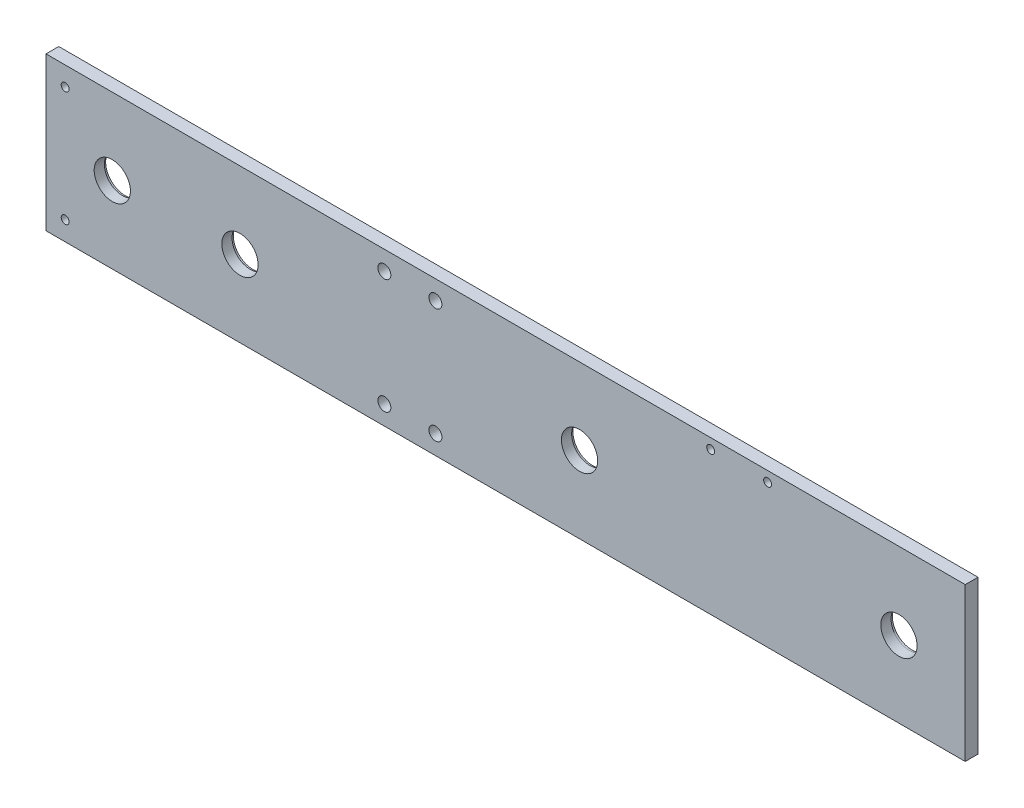
ISO-10303-21;
HEADER;
FILE_DESCRIPTION(('STEP AP214'),'2;1');
FILE_NAME('part.step','',(''),(''),'','','');
FILE_SCHEMA(('AUTOMOTIVE_DESIGN { 1 0 10303 214 1 1 1 1 }'));
ENDSEC;
DATA;
#1=APPLICATION_CONTEXT('core data for automotive mechanical design processes');
#2=APPLICATION_PROTOCOL_DEFINITION('international standard','automotive_design',2000,#1);
#3=PRODUCT_CONTEXT('',#1,'mechanical');
#4=PRODUCT('Part','Part','',(#3));
#5=PRODUCT_RELATED_PRODUCT_CATEGORY('part','',(#4));
#6=PRODUCT_DEFINITION_FORMATION('','',#4);
#7=PRODUCT_DEFINITION_CONTEXT('part definition',#1,'design');
#8=PRODUCT_DEFINITION('design','',#6,#7);
#9=PRODUCT_DEFINITION_SHAPE('','',#8);
#10=(LENGTH_UNIT() NAMED_UNIT(*) SI_UNIT(.MILLI.,.METRE.));
#11=(NAMED_UNIT(*) PLANE_ANGLE_UNIT() SI_UNIT($,.RADIAN.));
#12=(NAMED_UNIT(*) SI_UNIT($,.STERADIAN.) SOLID_ANGLE_UNIT());
#13=UNCERTAINTY_MEASURE_WITH_UNIT(LENGTH_MEASURE(1.E-05),#10,'distance_accuracy_value','');
#14=(GEOMETRIC_REPRESENTATION_CONTEXT(3) GLOBAL_UNCERTAINTY_ASSIGNED_CONTEXT((#13)) GLOBAL_UNIT_ASSIGNED_CONTEXT((#10,
#11,#12)) REPRESENTATION_CONTEXT('',''));
#15=CARTESIAN_POINT('',(0.,0.,0.));
#16=DIRECTION('',(0.,0.,1.));
#17=DIRECTION('',(1.,0.,0.));
#18=AXIS2_PLACEMENT_3D('',#15,#16,#17);
#19=CARTESIAN_POINT('',(0.,0.,-4.));
#20=DIRECTION('',(0.,0.,1.));
#21=DIRECTION('',(1.,0.,0.));
#22=AXIS2_PLACEMENT_3D('',#19,#20,#21);
#23=PLANE('',#22);
#24=CARTESIAN_POINT('',(183.,0.,-4.));
#25=DIRECTION('',(0.,0.,1.));
#26=DIRECTION('',(1.,0.,0.));
#27=AXIS2_PLACEMENT_3D('',#24,#25,#26);
#28=CIRCLE('',#27,7.10000000000001);
#29=CARTESIAN_POINT('',(190.1,0.,-4.));
#30=VERTEX_POINT('',#29);
#31=EDGE_CURVE('E135',#30,#30,#28,.T.);
#32=ORIENTED_EDGE('',*,*,#31,.T.);
#33=EDGE_LOOP('',(#32));
#34=FACE_BOUND('',#33,.T.);
#35=CARTESIAN_POINT('',(183.,0.,-4.));
#36=DIRECTION('',(0.,0.,-1.));
#37=DIRECTION('',(-1.,0.,0.));
#38=AXIS2_PLACEMENT_3D('',#35,#36,#37);
#39=CIRCLE('',#38,7.60000000000001);
#40=CARTESIAN_POINT('',(175.4,0.,-4.));
#41=VERTEX_POINT('',#40);
#42=EDGE_CURVE('E115',#41,#41,#39,.T.);
#43=ORIENTED_EDGE('',*,*,#42,.T.);
#44=EDGE_LOOP('',(#43));
#45=FACE_BOUND('',#44,.T.);
#46=ADVANCED_FACE('F34',(#34,#45),#23,.F.);
#47=CARTESIAN_POINT('',(49.9999999999999,0.,-4.));
#48=DIRECTION('',(0.,0.,1.));
#49=DIRECTION('',(1.,0.,0.));
#50=AXIS2_PLACEMENT_3D('',#47,#48,#49);
#51=CIRCLE('',#50,7.09999999999999);
#52=CARTESIAN_POINT('',(57.0999999999999,0.,-4.));
#53=VERTEX_POINT('',#52);
#54=EDGE_CURVE('E141',#53,#53,#51,.T.);
#55=ORIENTED_EDGE('',*,*,#54,.T.);
#56=EDGE_LOOP('',(#55));
#57=FACE_BOUND('',#56,.T.);
#58=CARTESIAN_POINT('',(49.9999999999999,0.,-4.));
#59=DIRECTION('',(0.,0.,-1.));
#60=DIRECTION('',(-1.,0.,0.));
#61=AXIS2_PLACEMENT_3D('',#58,#59,#60);
#62=CIRCLE('',#61,7.6);
#63=CARTESIAN_POINT('',(42.3999999999999,0.,-4.));
#64=VERTEX_POINT('',#63);
#65=EDGE_CURVE('E118',#64,#64,#62,.T.);
#66=ORIENTED_EDGE('',*,*,#65,.T.);
#67=EDGE_LOOP('',(#66));
#68=FACE_BOUND('',#67,.T.);
#69=ADVANCED_FACE('F185',(#57,#68),#23,.F.);
#70=CARTESIAN_POINT('',(0.,-1.01224326104513E-13,-4.));
#71=DIRECTION('',(0.,0.,1.));
#72=DIRECTION('',(1.,0.,0.));
#73=AXIS2_PLACEMENT_3D('',#70,#71,#72);
#74=CIRCLE('',#73,7.1);
#75=CARTESIAN_POINT('',(7.10000000000002,-1.01224326104513E-13,-4.));
#76=VERTEX_POINT('',#75);
#77=EDGE_CURVE('E150',#76,#76,#74,.T.);
#78=ORIENTED_EDGE('',*,*,#77,.T.);
#79=EDGE_LOOP('',(#78));
#80=FACE_BOUND('',#79,.T.);
#81=CARTESIAN_POINT('',(0.,0.,-4.));
#82=DIRECTION('',(0.,0.,-1.));
#83=DIRECTION('',(-1.,0.,0.));
#84=AXIS2_PLACEMENT_3D('',#81,#82,#83);
#85=CIRCLE('',#84,7.6);
#86=CARTESIAN_POINT('',(-7.59999999999998,0.,-4.));
#87=VERTEX_POINT('',#86);
#88=EDGE_CURVE('E122',#87,#87,#85,.T.);
#89=ORIENTED_EDGE('',*,*,#88,.T.);
#90=EDGE_LOOP('',(#89));
#91=FACE_BOUND('',#90,.T.);
#92=ADVANCED_FACE('F191',(#80,#91),#23,.F.);
#93=CARTESIAN_POINT('',(308.082550187469,-0.200000000000128,-4.));
#94=DIRECTION('',(0.,0.,1.));
#95=DIRECTION('',(1.,0.,0.));
#96=AXIS2_PLACEMENT_3D('',#93,#94,#95);
#97=CIRCLE('',#96,7.09999999999998);
#98=CARTESIAN_POINT('',(315.182550187469,-0.200000000000128,-4.));
#99=VERTEX_POINT('',#98);
#100=EDGE_CURVE('E159',#99,#99,#97,.T.);
#101=ORIENTED_EDGE('',*,*,#100,.T.);
#102=EDGE_LOOP('',(#101));
#103=FACE_BOUND('',#102,.T.);
#104=CARTESIAN_POINT('',(308.082550187468,0.,-4.));
#105=DIRECTION('',(0.,0.,-1.));
#106=DIRECTION('',(-1.,0.,0.));
#107=AXIS2_PLACEMENT_3D('',#104,#105,#106);
#108=CIRCLE('',#107,7.6);
#109=CARTESIAN_POINT('',(300.482550187468,0.,-4.));
#110=VERTEX_POINT('',#109);
#111=EDGE_CURVE('E125',#110,#110,#108,.T.);
#112=ORIENTED_EDGE('',*,*,#111,.T.);
#113=EDGE_LOOP('',(#112));
#114=FACE_BOUND('',#113,.T.);
#115=ADVANCED_FACE('F182',(#103,#114),#23,.F.);
#116=CARTESIAN_POINT('',(-25.9587249062652,-30.0000000000001,-4.));
#117=DIRECTION('',(0.,-1.,0.));
#118=DIRECTION('',(1.,0.,0.));
#119=AXIS2_PLACEMENT_3D('',#116,#117,#118);
#120=PLANE('',#119);
#121=DIRECTION('',(1.,0.,0.));
#122=VECTOR('',#121,1.);
#123=CARTESIAN_POINT('',(-25.9587249062652,-30.0000000000001,0.));
#124=LINE('',#123,#122);
#125=CARTESIAN_POINT('',(-25.9587249062652,-30.0000000000001,0.));
#126=VERTEX_POINT('',#125);
#127=CARTESIAN_POINT('',(334.041275093735,-30.0000000000001,0.));
#128=VERTEX_POINT('',#127);
#129=EDGE_CURVE('E162',#126,#128,#124,.T.);
#130=ORIENTED_EDGE('',*,*,#129,.F.);
#131=DIRECTION('',(0.,0.,1.));
#132=VECTOR('',#131,1.);
#133=CARTESIAN_POINT('',(-25.9587249062652,-30.0000000000001,-4.));
#134=LINE('',#133,#132);
#135=CARTESIAN_POINT('',(-25.9587249062652,-30.0000000000001,-5.));
#136=VERTEX_POINT('',#135);
#137=EDGE_CURVE('E11',#136,#126,#134,.T.);
#138=ORIENTED_EDGE('',*,*,#137,.F.);
#139=DIRECTION('',(-1.,0.,0.));
#140=VECTOR('',#139,1.);
#141=CARTESIAN_POINT('',(0.,-30.0000000000001,-5.));
#142=LINE('',#141,#140);
#143=CARTESIAN_POINT('',(334.041275093735,-30.0000000000001,-5.));
#144=VERTEX_POINT('',#143);
#145=EDGE_CURVE('E87',#144,#136,#142,.T.);
#146=ORIENTED_EDGE('',*,*,#145,.F.);
#147=DIRECTION('',(0.,0.,1.));
#148=VECTOR('',#147,1.);
#149=CARTESIAN_POINT('',(334.041275093735,-30.0000000000001,-4.));
#150=LINE('',#149,#148);
#151=EDGE_CURVE('E38',#144,#128,#150,.T.);
#152=ORIENTED_EDGE('',*,*,#151,.T.);
#153=EDGE_LOOP('',(#130,#138,#146,#152));
#154=FACE_BOUND('',#153,.T.);
#155=ADVANCED_FACE('F36',(#154),#120,.T.);
#156=CARTESIAN_POINT('',(-25.9587249062653,29.9999999999999,-4.));
#157=DIRECTION('',(-1.,0.,0.));
#158=DIRECTION('',(0.,-1.,0.));
#159=AXIS2_PLACEMENT_3D('',#156,#157,#158);
#160=PLANE('',#159);
#161=DIRECTION('',(0.,-1.,0.));
#162=VECTOR('',#161,1.);
#163=CARTESIAN_POINT('',(-25.9587249062653,29.9999999999999,0.));
#164=LINE('',#163,#162);
#165=CARTESIAN_POINT('',(-25.9587249062653,29.9999999999999,0.));
#166=VERTEX_POINT('',#165);
#167=EDGE_CURVE('E85',#166,#126,#164,.T.);
#168=ORIENTED_EDGE('',*,*,#167,.F.);
#169=DIRECTION('',(0.,0.,1.));
#170=VECTOR('',#169,1.);
#171=CARTESIAN_POINT('',(-25.9587249062653,29.9999999999999,-4.));
#172=LINE('',#171,#170);
#173=CARTESIAN_POINT('',(-25.9587249062652,29.9999999999999,-5.));
#174=VERTEX_POINT('',#173);
#175=EDGE_CURVE('E43',#174,#166,#172,.T.);
#176=ORIENTED_EDGE('',*,*,#175,.F.);
#177=DIRECTION('',(0.,1.,0.));
#178=VECTOR('',#177,1.);
#179=CARTESIAN_POINT('',(-25.9587249062653,0.,-5.));
#180=LINE('',#179,#178);
#181=EDGE_CURVE('E90',#136,#174,#180,.T.);
#182=ORIENTED_EDGE('',*,*,#181,.F.);
#183=ORIENTED_EDGE('',*,*,#137,.T.);
#184=EDGE_LOOP('',(#168,#176,#182,#183));
#185=FACE_BOUND('',#184,.T.);
#186=ADVANCED_FACE('F174',(#185),#160,.T.);
#187=CARTESIAN_POINT('',(334.041275093735,29.9999999999999,-4.));
#188=DIRECTION('',(0.,1.,0.));
#189=DIRECTION('',(-1.,0.,0.));
#190=AXIS2_PLACEMENT_3D('',#187,#188,#189);
#191=PLANE('',#190);
#192=DIRECTION('',(-1.,0.,0.));
#193=VECTOR('',#192,1.);
#194=CARTESIAN_POINT('',(334.041275093735,29.9999999999999,0.));
#195=LINE('',#194,#193);
#196=CARTESIAN_POINT('',(334.041275093735,29.9999999999999,0.));
#197=VERTEX_POINT('',#196);
#198=EDGE_CURVE('E167',#197,#166,#195,.T.);
#199=ORIENTED_EDGE('',*,*,#198,.F.);
#200=DIRECTION('',(0.,0.,1.));
#201=VECTOR('',#200,1.);
#202=CARTESIAN_POINT('',(334.041275093735,29.9999999999999,-4.));
#203=LINE('',#202,#201);
#204=CARTESIAN_POINT('',(334.041275093735,29.9999999999999,-5.));
#205=VERTEX_POINT('',#204);
#206=EDGE_CURVE('E84',#205,#197,#203,.T.);
#207=ORIENTED_EDGE('',*,*,#206,.F.);
#208=DIRECTION('',(1.,0.,0.));
#209=VECTOR('',#208,1.);
#210=CARTESIAN_POINT('',(0.,29.9999999999999,-5.));
#211=LINE('',#210,#209);
#212=EDGE_CURVE('E95',#174,#205,#211,.T.);
#213=ORIENTED_EDGE('',*,*,#212,.F.);
#214=ORIENTED_EDGE('',*,*,#175,.T.);
#215=EDGE_LOOP('',(#199,#207,#213,#214));
#216=FACE_BOUND('',#215,.T.);
#217=ADVANCED_FACE('F171',(#216),#191,.T.);
#218=CARTESIAN_POINT('',(334.041275093735,-30.0000000000001,-4.));
#219=DIRECTION('',(1.,0.,0.));
#220=DIRECTION('',(0.,0.,-1.));
#221=AXIS2_PLACEMENT_3D('',#218,#219,#220);
#222=PLANE('',#221);
#223=DIRECTION('',(0.,1.,0.));
#224=VECTOR('',#223,1.);
#225=CARTESIAN_POINT('',(334.041275093735,-30.0000000000001,0.));
#226=LINE('',#225,#224);
#227=EDGE_CURVE('E81',#128,#197,#226,.T.);
#228=ORIENTED_EDGE('',*,*,#227,.F.);
#229=ORIENTED_EDGE('',*,*,#151,.F.);
#230=DIRECTION('',(0.,-1.,0.));
#231=VECTOR('',#230,1.);
#232=CARTESIAN_POINT('',(334.041275093735,0.,-5.));
#233=LINE('',#232,#231);
#234=EDGE_CURVE('E79',#205,#144,#233,.T.);
#235=ORIENTED_EDGE('',*,*,#234,.F.);
#236=ORIENTED_EDGE('',*,*,#206,.T.);
#237=EDGE_LOOP('',(#228,#229,#235,#236));
#238=FACE_BOUND('',#237,.T.);
#239=ADVANCED_FACE('F77',(#238),#222,.T.);
#240=CARTESIAN_POINT('',(0.,0.,0.));
#241=DIRECTION('',(0.,0.,1.));
#242=DIRECTION('',(1.,0.,0.));
#243=AXIS2_PLACEMENT_3D('',#240,#241,#242);
#244=PLANE('',#243);
#245=CARTESIAN_POINT('',(126.548622117428,-22.4926529763063,0.));
#246=DIRECTION('',(0.,0.,-1.));
#247=DIRECTION('',(-1.,0.,0.));
#248=AXIS2_PLACEMENT_3D('',#245,#246,#247);
#249=CIRCLE('',#248,2.54999999999999);
#250=CARTESIAN_POINT('',(123.998622117428,-22.4926529763063,0.));
#251=VERTEX_POINT('',#250);
#252=EDGE_CURVE('E119',#251,#251,#249,.T.);
#253=ORIENTED_EDGE('',*,*,#252,.T.);
#254=EDGE_LOOP('',(#253));
#255=FACE_BOUND('',#254,.T.);
#256=CARTESIAN_POINT('',(234.35,26.0000000000017,0.));
#257=DIRECTION('',(0.,0.,-1.));
#258=DIRECTION('',(-1.,0.,0.));
#259=AXIS2_PLACEMENT_3D('',#256,#257,#258);
#260=CIRCLE('',#259,1.54999999999976);
#261=CARTESIAN_POINT('',(232.800000000001,26.0000000000017,0.));
#262=VERTEX_POINT('',#261);
#263=EDGE_CURVE('E288',#262,#262,#260,.T.);
#264=ORIENTED_EDGE('',*,*,#263,.T.);
#265=EDGE_LOOP('',(#264));
#266=FACE_BOUND('',#265,.T.);
#267=CARTESIAN_POINT('',(256.65,26.0000000000017,0.));
#268=DIRECTION('',(0.,0.,-1.));
#269=DIRECTION('',(-1.,0.,0.));
#270=AXIS2_PLACEMENT_3D('',#267,#268,#269);
#271=CIRCLE('',#270,1.54999999999976);
#272=CARTESIAN_POINT('',(255.100000000001,26.0000000000017,0.));
#273=VERTEX_POINT('',#272);
#274=EDGE_CURVE('E292',#273,#273,#271,.T.);
#275=ORIENTED_EDGE('',*,*,#274,.T.);
#276=EDGE_LOOP('',(#275));
#277=FACE_BOUND('',#276,.T.);
#278=CARTESIAN_POINT('',(126.548622117428,22.4926529763065,0.));
#279=DIRECTION('',(0.,0.,-1.));
#280=DIRECTION('',(-1.,0.,0.));
#281=AXIS2_PLACEMENT_3D('',#278,#279,#280);
#282=CIRCLE('',#281,2.54999999999998);
#283=CARTESIAN_POINT('',(123.998622117428,22.4926529763065,0.));
#284=VERTEX_POINT('',#283);
#285=EDGE_CURVE('E296',#284,#284,#282,.T.);
#286=ORIENTED_EDGE('',*,*,#285,.T.);
#287=EDGE_LOOP('',(#286));
#288=FACE_BOUND('',#287,.T.);
#289=CARTESIAN_POINT('',(106.548622117428,22.4926529763067,0.));
#290=DIRECTION('',(0.,0.,1.));
#291=DIRECTION('',(1.,0.,0.));
#292=AXIS2_PLACEMENT_3D('',#289,#290,#291);
#293=CIRCLE('',#292,2.54999999999999);
#294=CARTESIAN_POINT('',(109.098622117428,22.4926529763067,0.));
#295=VERTEX_POINT('',#294);
#296=EDGE_CURVE('E114',#295,#295,#293,.T.);
#297=ORIENTED_EDGE('',*,*,#296,.F.);
#298=EDGE_LOOP('',(#297));
#299=FACE_BOUND('',#298,.T.);
#300=CARTESIAN_POINT('',(106.548622117428,-22.4926529763061,0.));
#301=DIRECTION('',(0.,0.,1.));
#302=DIRECTION('',(1.,0.,0.));
#303=AXIS2_PLACEMENT_3D('',#300,#301,#302);
#304=CIRCLE('',#303,2.55000000000001);
#305=CARTESIAN_POINT('',(109.098622117428,-22.4926529763061,0.));
#306=VERTEX_POINT('',#305);
#307=EDGE_CURVE('E131',#306,#306,#304,.T.);
#308=ORIENTED_EDGE('',*,*,#307,.F.);
#309=EDGE_LOOP('',(#308));
#310=FACE_BOUND('',#309,.T.);
#311=CARTESIAN_POINT('',(183.,0.,0.));
#312=DIRECTION('',(0.,0.,1.));
#313=DIRECTION('',(1.,0.,0.));
#314=AXIS2_PLACEMENT_3D('',#311,#312,#313);
#315=CIRCLE('',#314,7.10000000000001);
#316=CARTESIAN_POINT('',(190.1,0.,0.));
#317=VERTEX_POINT('',#316);
#318=EDGE_CURVE('E134',#317,#317,#315,.T.);
#319=ORIENTED_EDGE('',*,*,#318,.F.);
#320=EDGE_LOOP('',(#319));
#321=FACE_BOUND('',#320,.T.);
#322=CARTESIAN_POINT('',(49.9999999999999,0.,0.));
#323=DIRECTION('',(0.,0.,1.));
#324=DIRECTION('',(1.,0.,0.));
#325=AXIS2_PLACEMENT_3D('',#322,#323,#324);
#326=CIRCLE('',#325,7.09999999999999);
#327=CARTESIAN_POINT('',(57.0999999999999,0.,0.));
#328=VERTEX_POINT('',#327);
#329=EDGE_CURVE('E138',#328,#328,#326,.T.);
#330=ORIENTED_EDGE('',*,*,#329,.F.);
#331=EDGE_LOOP('',(#330));
#332=FACE_BOUND('',#331,.T.);
#333=CARTESIAN_POINT('',(-18.4513778825718,-22.4926529763061,0.));
#334=DIRECTION('',(0.,0.,1.));
#335=DIRECTION('',(1.,0.,0.));
#336=AXIS2_PLACEMENT_3D('',#333,#334,#335);
#337=CIRCLE('',#336,1.55);
#338=CARTESIAN_POINT('',(-16.9013778825718,-22.4926529763061,0.));
#339=VERTEX_POINT('',#338);
#340=EDGE_CURVE('E144',#339,#339,#337,.T.);
#341=ORIENTED_EDGE('',*,*,#340,.F.);
#342=EDGE_LOOP('',(#341));
#343=FACE_BOUND('',#342,.T.);
#344=CARTESIAN_POINT('',(0.,-1.01224326104513E-13,0.));
#345=DIRECTION('',(0.,0.,1.));
#346=DIRECTION('',(1.,0.,0.));
#347=AXIS2_PLACEMENT_3D('',#344,#345,#346);
#348=CIRCLE('',#347,7.1);
#349=CARTESIAN_POINT('',(7.10000000000002,-1.01224326104513E-13,0.));
#350=VERTEX_POINT('',#349);
#351=EDGE_CURVE('E149',#350,#350,#348,.T.);
#352=ORIENTED_EDGE('',*,*,#351,.F.);
#353=EDGE_LOOP('',(#352));
#354=FACE_BOUND('',#353,.T.);
#355=CARTESIAN_POINT('',(-18.4513778825717,22.4926529763067,0.));
#356=DIRECTION('',(0.,0.,1.));
#357=DIRECTION('',(1.,0.,0.));
#358=AXIS2_PLACEMENT_3D('',#355,#356,#357);
#359=CIRCLE('',#358,1.55);
#360=CARTESIAN_POINT('',(-16.9013778825717,22.4926529763067,0.));
#361=VERTEX_POINT('',#360);
#362=EDGE_CURVE('E153',#361,#361,#359,.T.);
#363=ORIENTED_EDGE('',*,*,#362,.F.);
#364=EDGE_LOOP('',(#363));
#365=FACE_BOUND('',#364,.T.);
#366=CARTESIAN_POINT('',(308.082550187469,-0.200000000000128,0.));
#367=DIRECTION('',(0.,0.,1.));
#368=DIRECTION('',(1.,0.,0.));
#369=AXIS2_PLACEMENT_3D('',#366,#367,#368);
#370=CIRCLE('',#369,7.09999999999998);
#371=CARTESIAN_POINT('',(315.182550187469,-0.200000000000128,0.));
#372=VERTEX_POINT('',#371);
#373=EDGE_CURVE('E158',#372,#372,#370,.T.);
#374=ORIENTED_EDGE('',*,*,#373,.F.);
#375=EDGE_LOOP('',(#374));
#376=FACE_BOUND('',#375,.T.);
#377=ORIENTED_EDGE('',*,*,#129,.T.);
#378=ORIENTED_EDGE('',*,*,#227,.T.);
#379=ORIENTED_EDGE('',*,*,#198,.T.);
#380=ORIENTED_EDGE('',*,*,#167,.T.);
#381=EDGE_LOOP('',(#377,#378,#379,#380));
#382=FACE_BOUND('',#381,.T.);
#383=ADVANCED_FACE('F173',(#255,#266,#277,#288,#299,#310,#321,#332,#343,#354,#365,#376,#382),
#244,.T.);
#384=CARTESIAN_POINT('',(308.082550187469,-0.200000000000128,-4.));
#385=DIRECTION('',(0.,0.,1.));
#386=DIRECTION('',(1.,0.,0.));
#387=AXIS2_PLACEMENT_3D('',#384,#385,#386);
#388=CYLINDRICAL_SURFACE('',#387,7.09999999999998);
#389=ORIENTED_EDGE('',*,*,#100,.F.);
#390=EDGE_LOOP('',(#389));
#391=FACE_BOUND('',#390,.T.);
#392=ORIENTED_EDGE('',*,*,#373,.T.);
#393=EDGE_LOOP('',(#392));
#394=FACE_BOUND('',#393,.T.);
#395=ADVANCED_FACE('F268',(#391,#394),#388,.F.);
#396=CARTESIAN_POINT('',(-18.4513778825717,22.4926529763067,-4.));
#397=DIRECTION('',(0.,0.,1.));
#398=DIRECTION('',(1.,0.,0.));
#399=AXIS2_PLACEMENT_3D('',#396,#397,#398);
#400=CYLINDRICAL_SURFACE('',#399,1.55);
#401=ORIENTED_EDGE('',*,*,#362,.T.);
#402=EDGE_LOOP('',(#401));
#403=FACE_BOUND('',#402,.T.);
#404=CARTESIAN_POINT('',(-18.4513778825717,22.4926529763067,-5.));
#405=DIRECTION('',(0.,0.,-1.));
#406=DIRECTION('',(-1.,0.,0.));
#407=AXIS2_PLACEMENT_3D('',#404,#405,#406);
#408=CIRCLE('',#407,1.55);
#409=CARTESIAN_POINT('',(-20.0013778825717,22.4926529763067,-5.));
#410=VERTEX_POINT('',#409);
#411=EDGE_CURVE('E105',#410,#410,#408,.F.);
#412=ORIENTED_EDGE('',*,*,#411,.F.);
#413=EDGE_LOOP('',(#412));
#414=FACE_BOUND('',#413,.T.);
#415=ADVANCED_FACE('F265',(#403,#414),#400,.F.);
#416=CARTESIAN_POINT('',(0.,-1.01224326104513E-13,-4.));
#417=DIRECTION('',(0.,0.,1.));
#418=DIRECTION('',(1.,0.,0.));
#419=AXIS2_PLACEMENT_3D('',#416,#417,#418);
#420=CYLINDRICAL_SURFACE('',#419,7.1);
#421=ORIENTED_EDGE('',*,*,#77,.F.);
#422=EDGE_LOOP('',(#421));
#423=FACE_BOUND('',#422,.T.);
#424=ORIENTED_EDGE('',*,*,#351,.T.);
#425=EDGE_LOOP('',(#424));
#426=FACE_BOUND('',#425,.T.);
#427=ADVANCED_FACE('F261',(#423,#426),#420,.F.);
#428=CARTESIAN_POINT('',(-18.4513778825718,-22.4926529763061,-4.));
#429=DIRECTION('',(0.,0.,1.));
#430=DIRECTION('',(1.,0.,0.));
#431=AXIS2_PLACEMENT_3D('',#428,#429,#430);
#432=CYLINDRICAL_SURFACE('',#431,1.55);
#433=ORIENTED_EDGE('',*,*,#340,.T.);
#434=EDGE_LOOP('',(#433));
#435=FACE_BOUND('',#434,.T.);
#436=CARTESIAN_POINT('',(-18.4513778825718,-22.4926529763061,-5.));
#437=DIRECTION('',(0.,0.,-1.));
#438=DIRECTION('',(-1.,0.,0.));
#439=AXIS2_PLACEMENT_3D('',#436,#437,#438);
#440=CIRCLE('',#439,1.55);
#441=CARTESIAN_POINT('',(-20.0013778825718,-22.4926529763061,-5.));
#442=VERTEX_POINT('',#441);
#443=EDGE_CURVE('E108',#442,#442,#440,.F.);
#444=ORIENTED_EDGE('',*,*,#443,.F.);
#445=EDGE_LOOP('',(#444));
#446=FACE_BOUND('',#445,.T.);
#447=ADVANCED_FACE('F257',(#435,#446),#432,.F.);
#448=CARTESIAN_POINT('',(49.9999999999999,0.,-4.));
#449=DIRECTION('',(0.,0.,1.));
#450=DIRECTION('',(1.,0.,0.));
#451=AXIS2_PLACEMENT_3D('',#448,#449,#450);
#452=CYLINDRICAL_SURFACE('',#451,7.09999999999999);
#453=ORIENTED_EDGE('',*,*,#54,.F.);
#454=EDGE_LOOP('',(#453));
#455=FACE_BOUND('',#454,.T.);
#456=ORIENTED_EDGE('',*,*,#329,.T.);
#457=EDGE_LOOP('',(#456));
#458=FACE_BOUND('',#457,.T.);
#459=ADVANCED_FACE('F253',(#455,#458),#452,.F.);
#460=CARTESIAN_POINT('',(183.,0.,-4.));
#461=DIRECTION('',(0.,0.,1.));
#462=DIRECTION('',(1.,0.,0.));
#463=AXIS2_PLACEMENT_3D('',#460,#461,#462);
#464=CYLINDRICAL_SURFACE('',#463,7.10000000000001);
#465=ORIENTED_EDGE('',*,*,#31,.F.);
#466=EDGE_LOOP('',(#465));
#467=FACE_BOUND('',#466,.T.);
#468=ORIENTED_EDGE('',*,*,#318,.T.);
#469=EDGE_LOOP('',(#468));
#470=FACE_BOUND('',#469,.T.);
#471=ADVANCED_FACE('F249',(#467,#470),#464,.F.);
#472=CARTESIAN_POINT('',(106.548622117428,-22.4926529763061,-4.));
#473=DIRECTION('',(0.,0.,1.));
#474=DIRECTION('',(1.,0.,0.));
#475=AXIS2_PLACEMENT_3D('',#472,#473,#474);
#476=CYLINDRICAL_SURFACE('',#475,2.55000000000001);
#477=ORIENTED_EDGE('',*,*,#307,.T.);
#478=EDGE_LOOP('',(#477));
#479=FACE_BOUND('',#478,.T.);
#480=CARTESIAN_POINT('',(106.548622117428,-22.4926529763061,-5.));
#481=DIRECTION('',(0.,0.,-1.));
#482=DIRECTION('',(-1.,0.,0.));
#483=AXIS2_PLACEMENT_3D('',#480,#481,#482);
#484=CIRCLE('',#483,2.55000000000001);
#485=CARTESIAN_POINT('',(103.998622117428,-22.4926529763061,-5.));
#486=VERTEX_POINT('',#485);
#487=EDGE_CURVE('E96',#486,#486,#484,.F.);
#488=ORIENTED_EDGE('',*,*,#487,.F.);
#489=EDGE_LOOP('',(#488));
#490=FACE_BOUND('',#489,.T.);
#491=ADVANCED_FACE('F218',(#479,#490),#476,.F.);
#492=CARTESIAN_POINT('',(106.548622117428,22.4926529763067,-4.));
#493=DIRECTION('',(0.,0.,1.));
#494=DIRECTION('',(1.,0.,0.));
#495=AXIS2_PLACEMENT_3D('',#492,#493,#494);
#496=CYLINDRICAL_SURFACE('',#495,2.54999999999999);
#497=ORIENTED_EDGE('',*,*,#296,.T.);
#498=EDGE_LOOP('',(#497));
#499=FACE_BOUND('',#498,.T.);
#500=CARTESIAN_POINT('',(106.548622117428,22.4926529763067,-5.));
#501=DIRECTION('',(0.,0.,-1.));
#502=DIRECTION('',(-1.,0.,0.));
#503=AXIS2_PLACEMENT_3D('',#500,#501,#502);
#504=CIRCLE('',#503,2.54999999999999);
#505=CARTESIAN_POINT('',(103.998622117428,22.4926529763067,-5.));
#506=VERTEX_POINT('',#505);
#507=EDGE_CURVE('E111',#506,#506,#504,.F.);
#508=ORIENTED_EDGE('',*,*,#507,.F.);
#509=EDGE_LOOP('',(#508));
#510=FACE_BOUND('',#509,.T.);
#511=ADVANCED_FACE('F208',(#499,#510),#496,.F.);
#512=CARTESIAN_POINT('',(308.082550187468,0.,-5.));
#513=DIRECTION('',(0.,0.,1.));
#514=DIRECTION('',(1.,0.,0.));
#515=AXIS2_PLACEMENT_3D('',#512,#513,#514);
#516=CYLINDRICAL_SURFACE('',#515,7.6);
#517=CARTESIAN_POINT('',(308.082550187468,0.,-5.));
#518=DIRECTION('',(0.,0.,-1.));
#519=DIRECTION('',(-1.,0.,0.));
#520=AXIS2_PLACEMENT_3D('',#517,#518,#519);
#521=CIRCLE('',#520,7.6);
#522=CARTESIAN_POINT('',(300.482550187468,0.,-5.));
#523=VERTEX_POINT('',#522);
#524=EDGE_CURVE('E99',#523,#523,#521,.T.);
#525=ORIENTED_EDGE('',*,*,#524,.T.);
#526=EDGE_LOOP('',(#525));
#527=FACE_BOUND('',#526,.T.);
#528=ORIENTED_EDGE('',*,*,#111,.F.);
#529=EDGE_LOOP('',(#528));
#530=FACE_BOUND('',#529,.T.);
#531=ADVANCED_FACE('F205',(#527,#530),#516,.F.);
#532=CARTESIAN_POINT('',(0.,0.,-5.));
#533=DIRECTION('',(0.,0.,1.));
#534=DIRECTION('',(1.,0.,0.));
#535=AXIS2_PLACEMENT_3D('',#532,#533,#534);
#536=CYLINDRICAL_SURFACE('',#535,7.6);
#537=CARTESIAN_POINT('',(0.,0.,-5.));
#538=DIRECTION('',(0.,0.,-1.));
#539=DIRECTION('',(-1.,0.,0.));
#540=AXIS2_PLACEMENT_3D('',#537,#538,#539);
#541=CIRCLE('',#540,7.6);
#542=CARTESIAN_POINT('',(-7.59999999999998,0.,-5.));
#543=VERTEX_POINT('',#542);
#544=EDGE_CURVE('E348',#543,#543,#541,.T.);
#545=ORIENTED_EDGE('',*,*,#544,.T.);
#546=EDGE_LOOP('',(#545));
#547=FACE_BOUND('',#546,.T.);
#548=ORIENTED_EDGE('',*,*,#88,.F.);
#549=EDGE_LOOP('',(#548));
#550=FACE_BOUND('',#549,.T.);
#551=ADVANCED_FACE('F207',(#547,#550),#536,.F.);
#552=CARTESIAN_POINT('',(49.9999999999999,0.,-5.));
#553=DIRECTION('',(0.,0.,1.));
#554=DIRECTION('',(1.,0.,0.));
#555=AXIS2_PLACEMENT_3D('',#552,#553,#554);
#556=CYLINDRICAL_SURFACE('',#555,7.6);
#557=CARTESIAN_POINT('',(49.9999999999999,0.,-5.));
#558=DIRECTION('',(0.,0.,-1.));
#559=DIRECTION('',(-1.,0.,0.));
#560=AXIS2_PLACEMENT_3D('',#557,#558,#559);
#561=CIRCLE('',#560,7.6);
#562=CARTESIAN_POINT('',(42.3999999999999,0.,-5.));
#563=VERTEX_POINT('',#562);
#564=EDGE_CURVE('E344',#563,#563,#561,.T.);
#565=ORIENTED_EDGE('',*,*,#564,.T.);
#566=EDGE_LOOP('',(#565));
#567=FACE_BOUND('',#566,.T.);
#568=ORIENTED_EDGE('',*,*,#65,.F.);
#569=EDGE_LOOP('',(#568));
#570=FACE_BOUND('',#569,.T.);
#571=ADVANCED_FACE('F215',(#567,#570),#556,.F.);
#572=CARTESIAN_POINT('',(183.,0.,-5.));
#573=DIRECTION('',(0.,0.,1.));
#574=DIRECTION('',(1.,0.,0.));
#575=AXIS2_PLACEMENT_3D('',#572,#573,#574);
#576=CYLINDRICAL_SURFACE('',#575,7.60000000000001);
#577=CARTESIAN_POINT('',(183.,0.,-5.));
#578=DIRECTION('',(0.,0.,-1.));
#579=DIRECTION('',(-1.,0.,0.));
#580=AXIS2_PLACEMENT_3D('',#577,#578,#579);
#581=CIRCLE('',#580,7.60000000000001);
#582=CARTESIAN_POINT('',(175.4,0.,-5.));
#583=VERTEX_POINT('',#582);
#584=EDGE_CURVE('E340',#583,#583,#581,.T.);
#585=ORIENTED_EDGE('',*,*,#584,.T.);
#586=EDGE_LOOP('',(#585));
#587=FACE_BOUND('',#586,.T.);
#588=ORIENTED_EDGE('',*,*,#42,.F.);
#589=EDGE_LOOP('',(#588));
#590=FACE_BOUND('',#589,.T.);
#591=ADVANCED_FACE('F226',(#587,#590),#576,.F.);
#592=CARTESIAN_POINT('',(126.548622117428,22.4926529763065,-5.));
#593=DIRECTION('',(0.,0.,1.));
#594=DIRECTION('',(1.,0.,0.));
#595=AXIS2_PLACEMENT_3D('',#592,#593,#594);
#596=CYLINDRICAL_SURFACE('',#595,2.54999999999998);
#597=CARTESIAN_POINT('',(126.548622117428,22.4926529763065,-5.));
#598=DIRECTION('',(0.,0.,-1.));
#599=DIRECTION('',(-1.,0.,0.));
#600=AXIS2_PLACEMENT_3D('',#597,#598,#599);
#601=CIRCLE('',#600,2.54999999999998);
#602=CARTESIAN_POINT('',(123.998622117428,22.4926529763065,-5.));
#603=VERTEX_POINT('',#602);
#604=EDGE_CURVE('E336',#603,#603,#601,.T.);
#605=ORIENTED_EDGE('',*,*,#604,.T.);
#606=EDGE_LOOP('',(#605));
#607=FACE_BOUND('',#606,.T.);
#608=ORIENTED_EDGE('',*,*,#285,.F.);
#609=EDGE_LOOP('',(#608));
#610=FACE_BOUND('',#609,.T.);
#611=ADVANCED_FACE('F230',(#607,#610),#596,.F.);
#612=CARTESIAN_POINT('',(126.548622117428,-22.4926529763063,-5.));
#613=DIRECTION('',(0.,0.,1.));
#614=DIRECTION('',(1.,0.,0.));
#615=AXIS2_PLACEMENT_3D('',#612,#613,#614);
#616=CYLINDRICAL_SURFACE('',#615,2.54999999999999);
#617=CARTESIAN_POINT('',(126.548622117428,-22.4926529763063,-5.));
#618=DIRECTION('',(0.,0.,-1.));
#619=DIRECTION('',(-1.,0.,0.));
#620=AXIS2_PLACEMENT_3D('',#617,#618,#619);
#621=CIRCLE('',#620,2.54999999999999);
#622=CARTESIAN_POINT('',(123.998622117428,-22.4926529763063,-5.));
#623=VERTEX_POINT('',#622);
#624=EDGE_CURVE('E332',#623,#623,#621,.T.);
#625=ORIENTED_EDGE('',*,*,#624,.T.);
#626=EDGE_LOOP('',(#625));
#627=FACE_BOUND('',#626,.T.);
#628=ORIENTED_EDGE('',*,*,#252,.F.);
#629=EDGE_LOOP('',(#628));
#630=FACE_BOUND('',#629,.T.);
#631=ADVANCED_FACE('F234',(#627,#630),#616,.F.);
#632=CARTESIAN_POINT('',(256.65,26.0000000000017,-5.));
#633=DIRECTION('',(0.,0.,1.));
#634=DIRECTION('',(1.,0.,0.));
#635=AXIS2_PLACEMENT_3D('',#632,#633,#634);
#636=CYLINDRICAL_SURFACE('',#635,1.54999999999976);
#637=CARTESIAN_POINT('',(256.65,26.0000000000017,-5.));
#638=DIRECTION('',(0.,0.,-1.));
#639=DIRECTION('',(-1.,0.,0.));
#640=AXIS2_PLACEMENT_3D('',#637,#638,#639);
#641=CIRCLE('',#640,1.54999999999976);
#642=CARTESIAN_POINT('',(255.100000000001,26.0000000000017,-5.));
#643=VERTEX_POINT('',#642);
#644=EDGE_CURVE('E328',#643,#643,#641,.T.);
#645=ORIENTED_EDGE('',*,*,#644,.T.);
#646=EDGE_LOOP('',(#645));
#647=FACE_BOUND('',#646,.T.);
#648=ORIENTED_EDGE('',*,*,#274,.F.);
#649=EDGE_LOOP('',(#648));
#650=FACE_BOUND('',#649,.T.);
#651=ADVANCED_FACE('F238',(#647,#650),#636,.F.);
#652=CARTESIAN_POINT('',(234.35,26.0000000000017,-5.));
#653=DIRECTION('',(0.,0.,1.));
#654=DIRECTION('',(1.,0.,0.));
#655=AXIS2_PLACEMENT_3D('',#652,#653,#654);
#656=CYLINDRICAL_SURFACE('',#655,1.54999999999976);
#657=CARTESIAN_POINT('',(234.35,26.0000000000017,-5.));
#658=DIRECTION('',(0.,0.,-1.));
#659=DIRECTION('',(-1.,0.,0.));
#660=AXIS2_PLACEMENT_3D('',#657,#658,#659);
#661=CIRCLE('',#660,1.54999999999976);
#662=CARTESIAN_POINT('',(232.800000000001,26.0000000000017,-5.));
#663=VERTEX_POINT('',#662);
#664=EDGE_CURVE('E128',#663,#663,#661,.T.);
#665=ORIENTED_EDGE('',*,*,#664,.T.);
#666=EDGE_LOOP('',(#665));
#667=FACE_BOUND('',#666,.T.);
#668=ORIENTED_EDGE('',*,*,#263,.F.);
#669=EDGE_LOOP('',(#668));
#670=FACE_BOUND('',#669,.T.);
#671=ADVANCED_FACE('F242',(#667,#670),#656,.F.);
#672=CARTESIAN_POINT('',(0.,0.,-5.));
#673=DIRECTION('',(0.,0.,-1.));
#674=DIRECTION('',(-1.,0.,0.));
#675=AXIS2_PLACEMENT_3D('',#672,#673,#674);
#676=PLANE('',#675);
#677=ORIENTED_EDGE('',*,*,#664,.F.);
#678=EDGE_LOOP('',(#677));
#679=FACE_BOUND('',#678,.T.);
#680=ORIENTED_EDGE('',*,*,#644,.F.);
#681=EDGE_LOOP('',(#680));
#682=FACE_BOUND('',#681,.T.);
#683=ORIENTED_EDGE('',*,*,#624,.F.);
#684=EDGE_LOOP('',(#683));
#685=FACE_BOUND('',#684,.T.);
#686=ORIENTED_EDGE('',*,*,#604,.F.);
#687=EDGE_LOOP('',(#686));
#688=FACE_BOUND('',#687,.T.);
#689=ORIENTED_EDGE('',*,*,#584,.F.);
#690=EDGE_LOOP('',(#689));
#691=FACE_BOUND('',#690,.T.);
#692=ORIENTED_EDGE('',*,*,#564,.F.);
#693=EDGE_LOOP('',(#692));
#694=FACE_BOUND('',#693,.T.);
#695=ORIENTED_EDGE('',*,*,#544,.F.);
#696=EDGE_LOOP('',(#695));
#697=FACE_BOUND('',#696,.T.);
#698=ORIENTED_EDGE('',*,*,#524,.F.);
#699=EDGE_LOOP('',(#698));
#700=FACE_BOUND('',#699,.T.);
#701=ORIENTED_EDGE('',*,*,#487,.T.);
#702=EDGE_LOOP('',(#701));
#703=FACE_BOUND('',#702,.T.);
#704=ORIENTED_EDGE('',*,*,#234,.T.);
#705=ORIENTED_EDGE('',*,*,#145,.T.);
#706=ORIENTED_EDGE('',*,*,#181,.T.);
#707=ORIENTED_EDGE('',*,*,#212,.T.);
#708=EDGE_LOOP('',(#704,#705,#706,#707));
#709=FACE_BOUND('',#708,.T.);
#710=ORIENTED_EDGE('',*,*,#411,.T.);
#711=EDGE_LOOP('',(#710));
#712=FACE_BOUND('',#711,.T.);
#713=ORIENTED_EDGE('',*,*,#443,.T.);
#714=EDGE_LOOP('',(#713));
#715=FACE_BOUND('',#714,.T.);
#716=ORIENTED_EDGE('',*,*,#507,.T.);
#717=EDGE_LOOP('',(#716));
#718=FACE_BOUND('',#717,.T.);
#719=ADVANCED_FACE('F93',(#679,#682,#685,#688,#691,#694,#697,#700,#703,#709,#712,#715,#718),
#676,.T.);
#720=CLOSED_SHELL('',(#46,#69,#92,#115,#155,#186,#217,#239,#383,#395,#415,#427,#447,#459,#471,
#491,#511,#531,#551,#571,#591,#611,#631,#651,#671,#719));
#721=MANIFOLD_SOLID_BREP('B2',#720);
#722=ADVANCED_BREP_SHAPE_REPRESENTATION('',(#18,#721),#14);
#723=SHAPE_DEFINITION_REPRESENTATION(#9,#722);
ENDSEC;
END-ISO-10303-21;
